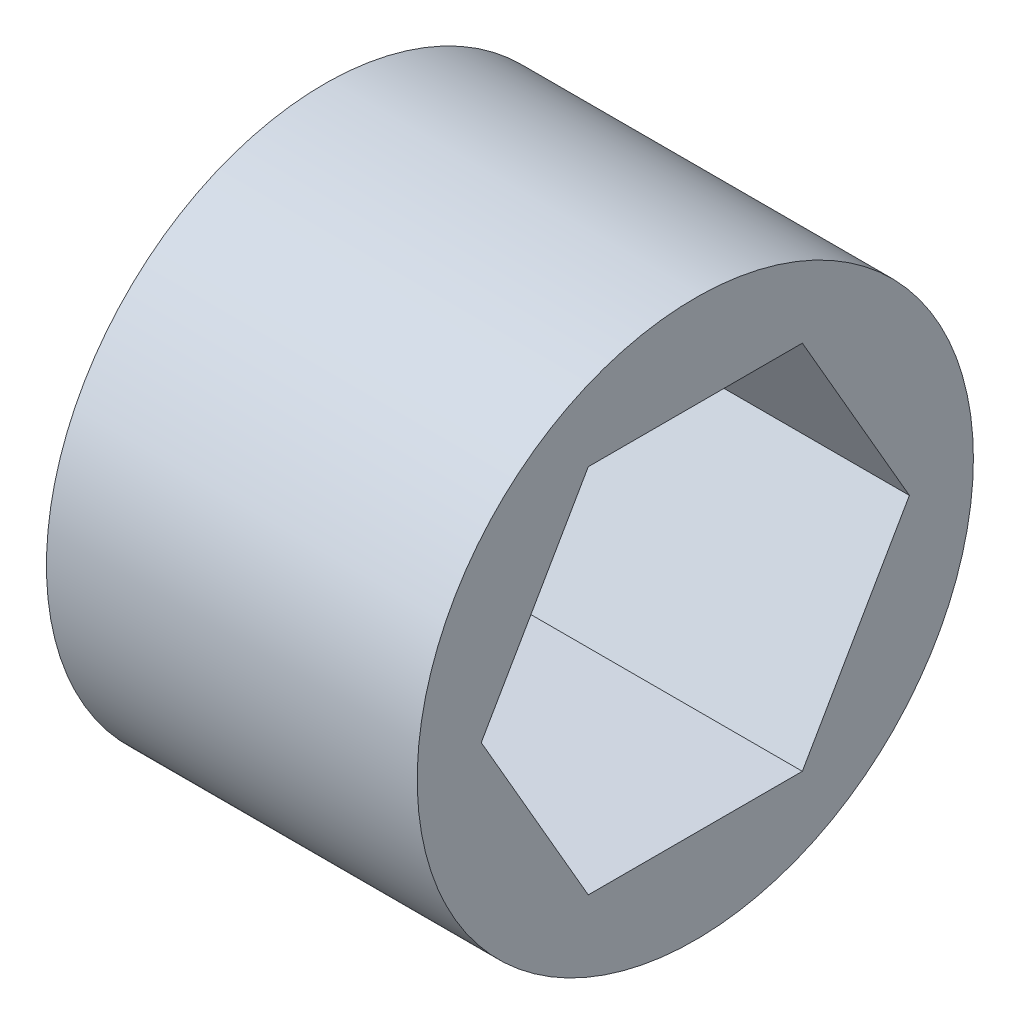
ISO-10303-21;
HEADER;
FILE_DESCRIPTION(('STEP AP214'),'2;1');
FILE_NAME('part.step','',(''),(''),'','','');
FILE_SCHEMA(('AUTOMOTIVE_DESIGN { 1 0 10303 214 1 1 1 1 }'));
ENDSEC;
DATA;
#1=APPLICATION_CONTEXT('core data for automotive mechanical design processes');
#2=APPLICATION_PROTOCOL_DEFINITION('international standard','automotive_design',2000,#1);
#3=PRODUCT_CONTEXT('',#1,'mechanical');
#4=PRODUCT('Part','Part','',(#3));
#5=PRODUCT_RELATED_PRODUCT_CATEGORY('part','',(#4));
#6=PRODUCT_DEFINITION_FORMATION('','',#4);
#7=PRODUCT_DEFINITION_CONTEXT('part definition',#1,'design');
#8=PRODUCT_DEFINITION('design','',#6,#7);
#9=PRODUCT_DEFINITION_SHAPE('','',#8);
#10=(LENGTH_UNIT() NAMED_UNIT(*) SI_UNIT(.MILLI.,.METRE.));
#11=(NAMED_UNIT(*) PLANE_ANGLE_UNIT() SI_UNIT($,.RADIAN.));
#12=(NAMED_UNIT(*) SI_UNIT($,.STERADIAN.) SOLID_ANGLE_UNIT());
#13=UNCERTAINTY_MEASURE_WITH_UNIT(LENGTH_MEASURE(1.E-05),#10,'distance_accuracy_value','');
#14=(GEOMETRIC_REPRESENTATION_CONTEXT(3) GLOBAL_UNCERTAINTY_ASSIGNED_CONTEXT((#13)) GLOBAL_UNIT_ASSIGNED_CONTEXT((#10,
#11,#12)) REPRESENTATION_CONTEXT('',''));
#15=CARTESIAN_POINT('',(0.,0.,0.));
#16=DIRECTION('',(0.,0.,1.));
#17=DIRECTION('',(1.,0.,0.));
#18=AXIS2_PLACEMENT_3D('',#15,#16,#17);
#19=CARTESIAN_POINT('',(12.7,0.,0.));
#20=DIRECTION('',(1.,0.,0.));
#21=DIRECTION('',(0.,0.,-1.));
#22=AXIS2_PLACEMENT_3D('',#19,#20,#21);
#23=PLANE('',#22);
#24=CARTESIAN_POINT('',(12.7,0.,0.));
#25=DIRECTION('',(1.,0.,0.));
#26=DIRECTION('',(0.,0.,-1.));
#27=AXIS2_PLACEMENT_3D('',#24,#25,#26);
#28=CIRCLE('',#27,9.525);
#29=CARTESIAN_POINT('',(12.7,0.,-9.525));
#30=VERTEX_POINT('',#29);
#31=EDGE_CURVE('E11',#30,#30,#28,.T.);
#32=ORIENTED_EDGE('',*,*,#31,.T.);
#33=EDGE_LOOP('',(#32));
#34=FACE_BOUND('',#33,.T.);
#35=DIRECTION('',(0.,-0.866025403784438,0.5));
#36=VECTOR('',#35,1.);
#37=CARTESIAN_POINT('',(12.7,6.35,3.66617420935412));
#38=LINE('',#37,#36);
#39=CARTESIAN_POINT('',(12.7,6.35,3.66617420935412));
#40=VERTEX_POINT('',#39);
#41=CARTESIAN_POINT('',(12.7,0.,7.33234841870825));
#42=VERTEX_POINT('',#41);
#43=EDGE_CURVE('E93',#40,#42,#38,.T.);
#44=ORIENTED_EDGE('',*,*,#43,.F.);
#45=DIRECTION('',(0.,0.,1.));
#46=VECTOR('',#45,1.);
#47=CARTESIAN_POINT('',(12.7,6.35,-3.66617420935412));
#48=LINE('',#47,#46);
#49=CARTESIAN_POINT('',(12.7,6.35,-3.66617420935412));
#50=VERTEX_POINT('',#49);
#51=EDGE_CURVE('E85',#50,#40,#48,.T.);
#52=ORIENTED_EDGE('',*,*,#51,.F.);
#53=DIRECTION('',(0.,0.866025403784439,0.5));
#54=VECTOR('',#53,1.);
#55=CARTESIAN_POINT('',(12.7,0.,-7.33234841870825));
#56=LINE('',#55,#54);
#57=CARTESIAN_POINT('',(12.7,0.,-7.33234841870825));
#58=VERTEX_POINT('',#57);
#59=EDGE_CURVE('E113',#58,#50,#56,.T.);
#60=ORIENTED_EDGE('',*,*,#59,.F.);
#61=DIRECTION('',(0.,0.866025403784439,-0.5));
#62=VECTOR('',#61,1.);
#63=CARTESIAN_POINT('',(12.7,-6.35,-3.66617420935413));
#64=LINE('',#63,#62);
#65=CARTESIAN_POINT('',(12.7,-6.35,-3.66617420935413));
#66=VERTEX_POINT('',#65);
#67=EDGE_CURVE('E111',#66,#58,#64,.T.);
#68=ORIENTED_EDGE('',*,*,#67,.F.);
#69=DIRECTION('',(0.,0.,-1.));
#70=VECTOR('',#69,1.);
#71=CARTESIAN_POINT('',(12.7,-6.35,3.66617420935412));
#72=LINE('',#71,#70);
#73=CARTESIAN_POINT('',(12.7,-6.35,3.66617420935412));
#74=VERTEX_POINT('',#73);
#75=EDGE_CURVE('E107',#74,#66,#72,.T.);
#76=ORIENTED_EDGE('',*,*,#75,.F.);
#77=DIRECTION('',(0.,-0.866025403784439,-0.5));
#78=VECTOR('',#77,1.);
#79=CARTESIAN_POINT('',(12.7,0.,7.33234841870825));
#80=LINE('',#79,#78);
#81=EDGE_CURVE('E105',#42,#74,#80,.T.);
#82=ORIENTED_EDGE('',*,*,#81,.F.);
#83=EDGE_LOOP('',(#44,#52,#60,#68,#76,#82));
#84=FACE_BOUND('',#83,.T.);
#85=ADVANCED_FACE('F32',(#34,#84),#23,.T.);
#86=CARTESIAN_POINT('',(0.,0.,0.));
#87=DIRECTION('',(1.,0.,0.));
#88=DIRECTION('',(0.,0.,-1.));
#89=AXIS2_PLACEMENT_3D('',#86,#87,#88);
#90=PLANE('',#89);
#91=CARTESIAN_POINT('',(0.,0.,0.));
#92=DIRECTION('',(1.,0.,0.));
#93=DIRECTION('',(0.,0.,-1.));
#94=AXIS2_PLACEMENT_3D('',#91,#92,#93);
#95=CIRCLE('',#94,9.525);
#96=CARTESIAN_POINT('',(0.,0.,-9.525));
#97=VERTEX_POINT('',#96);
#98=EDGE_CURVE('E36',#97,#97,#95,.T.);
#99=ORIENTED_EDGE('',*,*,#98,.F.);
#100=EDGE_LOOP('',(#99));
#101=FACE_BOUND('',#100,.T.);
#102=DIRECTION('',(0.,0.,1.));
#103=VECTOR('',#102,1.);
#104=CARTESIAN_POINT('',(0.,6.35,-3.66617420935412));
#105=LINE('',#104,#103);
#106=CARTESIAN_POINT('',(0.,6.35,-3.66617420935413));
#107=VERTEX_POINT('',#106);
#108=CARTESIAN_POINT('',(0.,6.35,3.66617420935412));
#109=VERTEX_POINT('',#108);
#110=EDGE_CURVE('E55',#107,#109,#105,.T.);
#111=ORIENTED_EDGE('',*,*,#110,.T.);
#112=DIRECTION('',(0.,-0.866025403784438,0.5));
#113=VECTOR('',#112,1.);
#114=CARTESIAN_POINT('',(0.,6.35,3.66617420935412));
#115=LINE('',#114,#113);
#116=CARTESIAN_POINT('',(0.,0.,7.33234841870825));
#117=VERTEX_POINT('',#116);
#118=EDGE_CURVE('E100',#109,#117,#115,.T.);
#119=ORIENTED_EDGE('',*,*,#118,.T.);
#120=DIRECTION('',(0.,-0.866025403784439,-0.5));
#121=VECTOR('',#120,1.);
#122=CARTESIAN_POINT('',(0.,0.,7.33234841870825));
#123=LINE('',#122,#121);
#124=CARTESIAN_POINT('',(0.,-6.35,3.66617420935412));
#125=VERTEX_POINT('',#124);
#126=EDGE_CURVE('E117',#117,#125,#123,.T.);
#127=ORIENTED_EDGE('',*,*,#126,.T.);
#128=DIRECTION('',(0.,0.,-1.));
#129=VECTOR('',#128,1.);
#130=CARTESIAN_POINT('',(0.,-6.35,3.66617420935412));
#131=LINE('',#130,#129);
#132=CARTESIAN_POINT('',(0.,-6.35,-3.66617420935413));
#133=VERTEX_POINT('',#132);
#134=EDGE_CURVE('E120',#125,#133,#131,.T.);
#135=ORIENTED_EDGE('',*,*,#134,.T.);
#136=DIRECTION('',(0.,0.866025403784439,-0.5));
#137=VECTOR('',#136,1.);
#138=CARTESIAN_POINT('',(0.,-6.35,-3.66617420935413));
#139=LINE('',#138,#137);
#140=CARTESIAN_POINT('',(0.,0.,-7.33234841870825));
#141=VERTEX_POINT('',#140);
#142=EDGE_CURVE('E123',#133,#141,#139,.T.);
#143=ORIENTED_EDGE('',*,*,#142,.T.);
#144=DIRECTION('',(0.,0.866025403784439,0.5));
#145=VECTOR('',#144,1.);
#146=CARTESIAN_POINT('',(0.,0.,-7.33234841870825));
#147=LINE('',#146,#145);
#148=EDGE_CURVE('E94',#141,#107,#147,.T.);
#149=ORIENTED_EDGE('',*,*,#148,.T.);
#150=EDGE_LOOP('',(#111,#119,#127,#135,#143,#149));
#151=FACE_BOUND('',#150,.T.);
#152=ADVANCED_FACE('F140',(#101,#151),#90,.F.);
#153=CARTESIAN_POINT('',(12.7,0.,0.));
#154=DIRECTION('',(-1.,0.,0.));
#155=DIRECTION('',(0.,0.,1.));
#156=AXIS2_PLACEMENT_3D('',#153,#154,#155);
#157=CYLINDRICAL_SURFACE('',#156,9.525);
#158=ORIENTED_EDGE('',*,*,#31,.F.);
#159=EDGE_LOOP('',(#158));
#160=FACE_BOUND('',#159,.T.);
#161=ORIENTED_EDGE('',*,*,#98,.T.);
#162=EDGE_LOOP('',(#161));
#163=FACE_BOUND('',#162,.T.);
#164=ADVANCED_FACE('F34',(#160,#163),#157,.T.);
#165=CARTESIAN_POINT('',(12.7,6.35,-3.66617420935412));
#166=DIRECTION('',(0.,-1.,0.));
#167=DIRECTION('',(0.,0.,-1.));
#168=AXIS2_PLACEMENT_3D('',#165,#166,#167);
#169=PLANE('',#168);
#170=ORIENTED_EDGE('',*,*,#110,.F.);
#171=DIRECTION('',(-1.,0.,0.));
#172=VECTOR('',#171,1.);
#173=CARTESIAN_POINT('',(12.7,6.35,-3.66617420935412));
#174=LINE('',#173,#172);
#175=EDGE_CURVE('E89',#50,#107,#174,.T.);
#176=ORIENTED_EDGE('',*,*,#175,.F.);
#177=ORIENTED_EDGE('',*,*,#51,.T.);
#178=DIRECTION('',(-1.,0.,0.));
#179=VECTOR('',#178,1.);
#180=CARTESIAN_POINT('',(12.7,6.35,3.66617420935412));
#181=LINE('',#180,#179);
#182=EDGE_CURVE('E88',#40,#109,#181,.T.);
#183=ORIENTED_EDGE('',*,*,#182,.T.);
#184=EDGE_LOOP('',(#170,#176,#177,#183));
#185=FACE_BOUND('',#184,.T.);
#186=ADVANCED_FACE('F87',(#185),#169,.T.);
#187=CARTESIAN_POINT('',(12.7,6.35,3.66617420935412));
#188=DIRECTION('',(0.,-0.5,-0.866025403784439));
#189=DIRECTION('',(0.,0.866025403784439,-0.5));
#190=AXIS2_PLACEMENT_3D('',#187,#188,#189);
#191=PLANE('',#190);
#192=ORIENTED_EDGE('',*,*,#118,.F.);
#193=ORIENTED_EDGE('',*,*,#182,.F.);
#194=ORIENTED_EDGE('',*,*,#43,.T.);
#195=DIRECTION('',(-1.,0.,0.));
#196=VECTOR('',#195,1.);
#197=CARTESIAN_POINT('',(12.7,0.,7.33234841870825));
#198=LINE('',#197,#196);
#199=EDGE_CURVE('E101',#42,#117,#198,.T.);
#200=ORIENTED_EDGE('',*,*,#199,.T.);
#201=EDGE_LOOP('',(#192,#193,#194,#200));
#202=FACE_BOUND('',#201,.T.);
#203=ADVANCED_FACE('F97',(#202),#191,.T.);
#204=CARTESIAN_POINT('',(12.7,0.,7.33234841870825));
#205=DIRECTION('',(0.,0.5,-0.866025403784439));
#206=DIRECTION('',(0.,0.866025403784439,0.5));
#207=AXIS2_PLACEMENT_3D('',#204,#205,#206);
#208=PLANE('',#207);
#209=ORIENTED_EDGE('',*,*,#126,.F.);
#210=ORIENTED_EDGE('',*,*,#199,.F.);
#211=ORIENTED_EDGE('',*,*,#81,.T.);
#212=DIRECTION('',(-1.,0.,0.));
#213=VECTOR('',#212,1.);
#214=CARTESIAN_POINT('',(12.7,-6.35,3.66617420935412));
#215=LINE('',#214,#213);
#216=EDGE_CURVE('E132',#74,#125,#215,.T.);
#217=ORIENTED_EDGE('',*,*,#216,.T.);
#218=EDGE_LOOP('',(#209,#210,#211,#217));
#219=FACE_BOUND('',#218,.T.);
#220=ADVANCED_FACE('F136',(#219),#208,.T.);
#221=CARTESIAN_POINT('',(12.7,-6.35,3.66617420935412));
#222=DIRECTION('',(0.,1.,0.));
#223=DIRECTION('',(0.,0.,1.));
#224=AXIS2_PLACEMENT_3D('',#221,#222,#223);
#225=PLANE('',#224);
#226=ORIENTED_EDGE('',*,*,#134,.F.);
#227=ORIENTED_EDGE('',*,*,#216,.F.);
#228=ORIENTED_EDGE('',*,*,#75,.T.);
#229=DIRECTION('',(-1.,0.,0.));
#230=VECTOR('',#229,1.);
#231=CARTESIAN_POINT('',(12.7,-6.35,-3.66617420935413));
#232=LINE('',#231,#230);
#233=EDGE_CURVE('E130',#66,#133,#232,.T.);
#234=ORIENTED_EDGE('',*,*,#233,.T.);
#235=EDGE_LOOP('',(#226,#227,#228,#234));
#236=FACE_BOUND('',#235,.T.);
#237=ADVANCED_FACE('F148',(#236),#225,.T.);
#238=CARTESIAN_POINT('',(12.7,-6.35,-3.66617420935413));
#239=DIRECTION('',(0.,0.5,0.866025403784439));
#240=DIRECTION('',(0.,-0.866025403784439,0.5));
#241=AXIS2_PLACEMENT_3D('',#238,#239,#240);
#242=PLANE('',#241);
#243=ORIENTED_EDGE('',*,*,#142,.F.);
#244=ORIENTED_EDGE('',*,*,#233,.F.);
#245=ORIENTED_EDGE('',*,*,#67,.T.);
#246=DIRECTION('',(-1.,0.,0.));
#247=VECTOR('',#246,1.);
#248=CARTESIAN_POINT('',(12.7,0.,-7.33234841870825));
#249=LINE('',#248,#247);
#250=EDGE_CURVE('E47',#58,#141,#249,.T.);
#251=ORIENTED_EDGE('',*,*,#250,.T.);
#252=EDGE_LOOP('',(#243,#244,#245,#251));
#253=FACE_BOUND('',#252,.T.);
#254=ADVANCED_FACE('F146',(#253),#242,.T.);
#255=CARTESIAN_POINT('',(12.7,0.,-7.33234841870825));
#256=DIRECTION('',(0.,-0.5,0.866025403784439));
#257=DIRECTION('',(0.,-0.866025403784439,-0.5));
#258=AXIS2_PLACEMENT_3D('',#255,#256,#257);
#259=PLANE('',#258);
#260=ORIENTED_EDGE('',*,*,#148,.F.);
#261=ORIENTED_EDGE('',*,*,#250,.F.);
#262=ORIENTED_EDGE('',*,*,#59,.T.);
#263=ORIENTED_EDGE('',*,*,#175,.T.);
#264=EDGE_LOOP('',(#260,#261,#262,#263));
#265=FACE_BOUND('',#264,.T.);
#266=ADVANCED_FACE('F142',(#265),#259,.T.);
#267=CLOSED_SHELL('',(#85,#152,#164,#186,#203,#220,#237,#254,#266));
#268=MANIFOLD_SOLID_BREP('B2',#267);
#269=ADVANCED_BREP_SHAPE_REPRESENTATION('',(#18,#268),#14);
#270=SHAPE_DEFINITION_REPRESENTATION(#9,#269);
ENDSEC;
END-ISO-10303-21;
